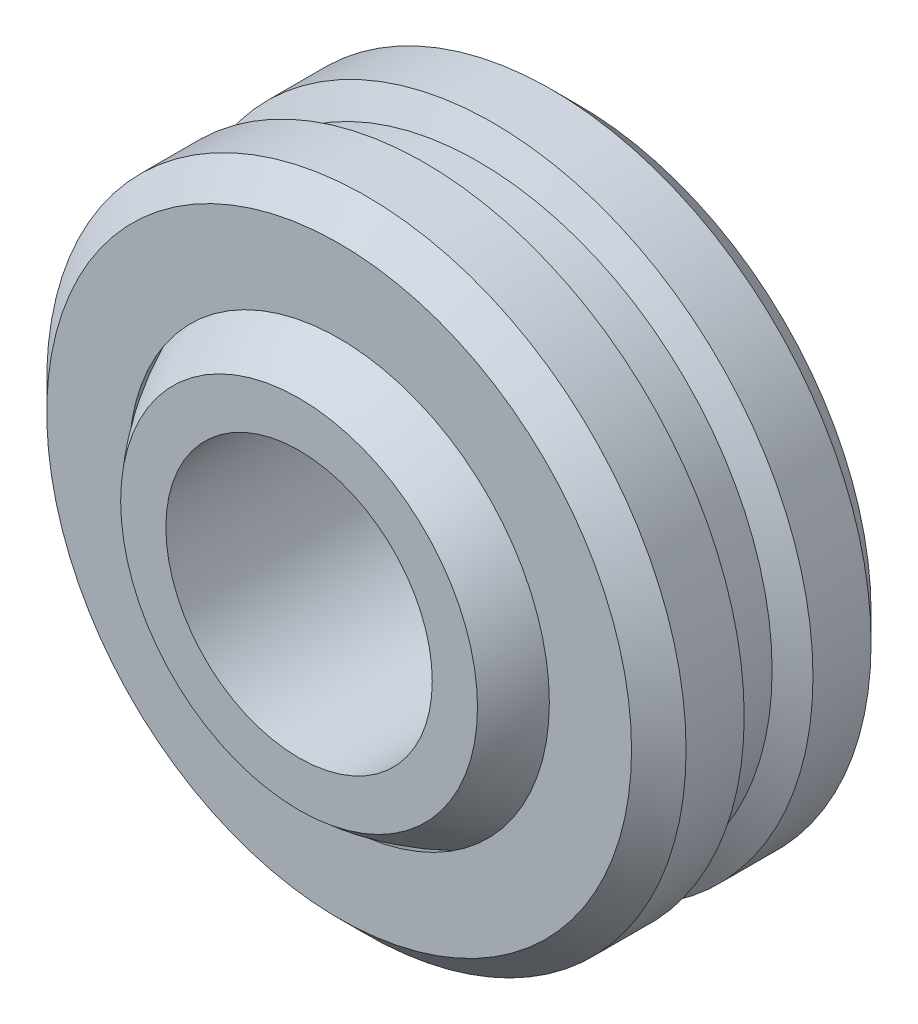
ISO-10303-21;
HEADER;
FILE_DESCRIPTION(('STEP AP214'),'2;1');
FILE_NAME('part.step','',(''),(''),'','','');
FILE_SCHEMA(('AUTOMOTIVE_DESIGN { 1 0 10303 214 1 1 1 1 }'));
ENDSEC;
DATA;
#1=APPLICATION_CONTEXT('core data for automotive mechanical design processes');
#2=APPLICATION_PROTOCOL_DEFINITION('international standard','automotive_design',2000,#1);
#3=PRODUCT_CONTEXT('',#1,'mechanical');
#4=PRODUCT('Part','Part','',(#3));
#5=PRODUCT_RELATED_PRODUCT_CATEGORY('part','',(#4));
#6=PRODUCT_DEFINITION_FORMATION('','',#4);
#7=PRODUCT_DEFINITION_CONTEXT('part definition',#1,'design');
#8=PRODUCT_DEFINITION('design','',#6,#7);
#9=PRODUCT_DEFINITION_SHAPE('','',#8);
#10=(LENGTH_UNIT() NAMED_UNIT(*) SI_UNIT(.MILLI.,.METRE.));
#11=(NAMED_UNIT(*) PLANE_ANGLE_UNIT() SI_UNIT($,.RADIAN.));
#12=(NAMED_UNIT(*) SI_UNIT($,.STERADIAN.) SOLID_ANGLE_UNIT());
#13=UNCERTAINTY_MEASURE_WITH_UNIT(LENGTH_MEASURE(1.E-05),#10,'distance_accuracy_value','');
#14=(GEOMETRIC_REPRESENTATION_CONTEXT(3) GLOBAL_UNCERTAINTY_ASSIGNED_CONTEXT((#13)) GLOBAL_UNIT_ASSIGNED_CONTEXT((#10,
#11,#12)) REPRESENTATION_CONTEXT('',''));
#15=CARTESIAN_POINT('',(0.,0.,0.));
#16=DIRECTION('',(0.,0.,1.));
#17=DIRECTION('',(1.,0.,0.));
#18=AXIS2_PLACEMENT_3D('',#15,#16,#17);
#19=CARTESIAN_POINT('',(0.,0.,0.));
#20=DIRECTION('',(0.,-1.,0.));
#21=DIRECTION('',(-1.,0.,0.));
#22=AXIS2_PLACEMENT_3D('',#19,#20,#21);
#23=SPHERICAL_SURFACE('',#22,7.1374);
#24=CARTESIAN_POINT('',(0.,0.,0.));
#25=DIRECTION('',(0.,0.,1.));
#26=DIRECTION('',(1.,0.,0.));
#27=AXIS2_PLACEMENT_3D('',#24,#25,#26);
#28=SPHERICAL_SURFACE('',#27,7.1374);
#29=CARTESIAN_POINT('',(0.,0.,-4.7625));
#30=DIRECTION('',(0.,0.,1.));
#31=DIRECTION('',(1.,0.,0.));
#32=AXIS2_PLACEMENT_3D('',#29,#30,#31);
#33=CIRCLE('',#32,5.31611441844511);
#34=CARTESIAN_POINT('',(5.31611441844511,0.,-4.7625));
#35=VERTEX_POINT('',#34);
#36=EDGE_CURVE('E52',#35,#35,#33,.F.);
#37=ORIENTED_EDGE('',*,*,#36,.F.);
#38=EDGE_LOOP('',(#37));
#39=FACE_BOUND('',#38,.T.);
#40=CARTESIAN_POINT('',(0.,0.,4.7625));
#41=DIRECTION('',(0.,0.,-1.));
#42=DIRECTION('',(-1.,0.,0.));
#43=AXIS2_PLACEMENT_3D('',#40,#41,#42);
#44=CIRCLE('',#43,5.31611441844511);
#45=CARTESIAN_POINT('',(-5.31611441844511,0.,4.7625));
#46=VERTEX_POINT('',#45);
#47=EDGE_CURVE('E11',#46,#46,#44,.F.);
#48=ORIENTED_EDGE('',*,*,#47,.F.);
#49=EDGE_LOOP('',(#48));
#50=FACE_BOUND('',#49,.T.);
#51=ADVANCED_FACE('F40',(#39,#50),#28,.T.);
#52=CARTESIAN_POINT('',(0.,0.,-7.1374));
#53=DIRECTION('',(0.,0.,1.));
#54=DIRECTION('',(1.,0.,0.));
#55=AXIS2_PLACEMENT_3D('',#52,#53,#54);
#56=CYLINDRICAL_SURFACE('',#55,3.96875);
#57=CARTESIAN_POINT('',(0.,0.,-4.7625));
#58=DIRECTION('',(0.,0.,1.));
#59=DIRECTION('',(1.,0.,0.));
#60=AXIS2_PLACEMENT_3D('',#57,#58,#59);
#61=CIRCLE('',#60,3.96875);
#62=CARTESIAN_POINT('',(3.96875,0.,-4.7625));
#63=VERTEX_POINT('',#62);
#64=EDGE_CURVE('E43',#63,#63,#61,.F.);
#65=ORIENTED_EDGE('',*,*,#64,.T.);
#66=EDGE_LOOP('',(#65));
#67=FACE_BOUND('',#66,.T.);
#68=CARTESIAN_POINT('',(0.,0.,4.7625));
#69=DIRECTION('',(0.,0.,-1.));
#70=DIRECTION('',(-1.,0.,0.));
#71=AXIS2_PLACEMENT_3D('',#68,#69,#70);
#72=CIRCLE('',#71,3.96875);
#73=CARTESIAN_POINT('',(-3.96875,0.,4.7625));
#74=VERTEX_POINT('',#73);
#75=EDGE_CURVE('E47',#74,#74,#72,.F.);
#76=ORIENTED_EDGE('',*,*,#75,.T.);
#77=EDGE_LOOP('',(#76));
#78=FACE_BOUND('',#77,.T.);
#79=ADVANCED_FACE('F60',(#67,#78),#56,.F.);
#80=CARTESIAN_POINT('',(-9.525,9.525,4.7625));
#81=DIRECTION('',(0.,0.,-1.));
#82=DIRECTION('',(-1.,0.,0.));
#83=AXIS2_PLACEMENT_3D('',#80,#81,#82);
#84=PLANE('',#83);
#85=ORIENTED_EDGE('',*,*,#47,.T.);
#86=EDGE_LOOP('',(#85));
#87=FACE_BOUND('',#86,.T.);
#88=ORIENTED_EDGE('',*,*,#75,.F.);
#89=EDGE_LOOP('',(#88));
#90=FACE_BOUND('',#89,.T.);
#91=ADVANCED_FACE('F65',(#87,#90),#84,.F.);
#92=CARTESIAN_POINT('',(-9.525,-9.525,-4.7625));
#93=DIRECTION('',(0.,0.,1.));
#94=DIRECTION('',(1.,0.,0.));
#95=AXIS2_PLACEMENT_3D('',#92,#93,#94);
#96=PLANE('',#95);
#97=ORIENTED_EDGE('',*,*,#36,.T.);
#98=EDGE_LOOP('',(#97));
#99=FACE_BOUND('',#98,.T.);
#100=ORIENTED_EDGE('',*,*,#64,.F.);
#101=EDGE_LOOP('',(#100));
#102=FACE_BOUND('',#101,.T.);
#103=ADVANCED_FACE('F63',(#99,#102),#96,.F.);
#104=CLOSED_SHELL('',(#51,#79,#91,#103));
#105=MANIFOLD_SOLID_BREP('B2',#104);
#106=CARTESIAN_POINT('',(0.,0.,3.5687));
#107=DIRECTION('',(0.,0.,-1.));
#108=DIRECTION('',(-1.,0.,0.));
#109=AXIS2_PLACEMENT_3D('',#106,#107,#108);
#110=CYLINDRICAL_SURFACE('',#109,9.525);
#111=CARTESIAN_POINT('',(0.,0.,2.7559));
#112=DIRECTION('',(0.,0.,1.));
#113=DIRECTION('',(1.,0.,0.));
#114=AXIS2_PLACEMENT_3D('',#111,#112,#113);
#115=CIRCLE('',#114,9.525);
#116=CARTESIAN_POINT('',(9.525,0.,2.7559));
#117=VERTEX_POINT('',#116);
#118=EDGE_CURVE('E108',#117,#117,#115,.F.);
#119=ORIENTED_EDGE('',*,*,#118,.T.);
#120=EDGE_LOOP('',(#119));
#121=FACE_BOUND('',#120,.T.);
#122=CARTESIAN_POINT('',(0.,0.,1.02481440153467));
#123=DIRECTION('',(0.,0.,1.));
#124=DIRECTION('',(1.,0.,0.));
#125=AXIS2_PLACEMENT_3D('',#122,#123,#124);
#126=CIRCLE('',#125,9.525);
#127=CARTESIAN_POINT('',(9.525,0.,1.02481440153467));
#128=VERTEX_POINT('',#127);
#129=EDGE_CURVE('E125',#128,#128,#126,.T.);
#130=ORIENTED_EDGE('',*,*,#129,.T.);
#131=EDGE_LOOP('',(#130));
#132=FACE_BOUND('',#131,.T.);
#133=ADVANCED_FACE('F101',(#121,#132),#110,.T.);
#134=CARTESIAN_POINT('',(0.,0.,-2.7559));
#135=DIRECTION('',(0.,0.,1.));
#136=DIRECTION('',(1.,0.,0.));
#137=AXIS2_PLACEMENT_3D('',#134,#135,#136);
#138=CIRCLE('',#137,9.525);
#139=CARTESIAN_POINT('',(9.525,0.,-2.7559));
#140=VERTEX_POINT('',#139);
#141=EDGE_CURVE('E112',#140,#140,#138,.T.);
#142=ORIENTED_EDGE('',*,*,#141,.T.);
#143=EDGE_LOOP('',(#142));
#144=FACE_BOUND('',#143,.T.);
#145=CARTESIAN_POINT('',(0.,0.,-1.02481440153467));
#146=DIRECTION('',(0.,0.,1.));
#147=DIRECTION('',(1.,0.,0.));
#148=AXIS2_PLACEMENT_3D('',#145,#146,#147);
#149=CIRCLE('',#148,9.525);
#150=CARTESIAN_POINT('',(9.525,0.,-1.02481440153467));
#151=VERTEX_POINT('',#150);
#152=EDGE_CURVE('E136',#151,#151,#149,.T.);
#153=ORIENTED_EDGE('',*,*,#152,.F.);
#154=EDGE_LOOP('',(#153));
#155=FACE_BOUND('',#154,.T.);
#156=ADVANCED_FACE('F143',(#144,#155),#110,.T.);
#157=CARTESIAN_POINT('',(0.,0.,3.5687));
#158=DIRECTION('',(0.,0.,1.));
#159=DIRECTION('',(1.,0.,0.));
#160=AXIS2_PLACEMENT_3D('',#157,#158,#159);
#161=PLANE('',#160);
#162=CARTESIAN_POINT('',(0.,0.,3.5687));
#163=DIRECTION('',(0.,0.,1.));
#164=DIRECTION('',(1.,0.,0.));
#165=AXIS2_PLACEMENT_3D('',#162,#163,#164);
#166=CIRCLE('',#165,8.7122);
#167=CARTESIAN_POINT('',(8.7122,0.,3.5687));
#168=VERTEX_POINT('',#167);
#169=EDGE_CURVE('E116',#168,#168,#166,.T.);
#170=ORIENTED_EDGE('',*,*,#169,.T.);
#171=EDGE_LOOP('',(#170));
#172=FACE_BOUND('',#171,.T.);
#173=CARTESIAN_POINT('',(0.,0.,3.5687));
#174=DIRECTION('',(0.,0.,1.));
#175=DIRECTION('',(1.,0.,0.));
#176=AXIS2_PLACEMENT_3D('',#173,#174,#175);
#177=CIRCLE('',#176,6.26344975976307);
#178=CARTESIAN_POINT('',(6.26344975976307,0.,3.5687));
#179=VERTEX_POINT('',#178);
#180=EDGE_CURVE('E121',#179,#179,#177,.T.);
#181=ORIENTED_EDGE('',*,*,#180,.F.);
#182=EDGE_LOOP('',(#181));
#183=FACE_BOUND('',#182,.T.);
#184=ADVANCED_FACE('F145',(#172,#183),#161,.T.);
#185=CARTESIAN_POINT('',(0.,0.,-3.5687));
#186=DIRECTION('',(0.,0.,1.));
#187=DIRECTION('',(1.,0.,0.));
#188=AXIS2_PLACEMENT_3D('',#185,#186,#187);
#189=PLANE('',#188);
#190=CARTESIAN_POINT('',(0.,0.,-3.5687));
#191=DIRECTION('',(0.,0.,1.));
#192=DIRECTION('',(1.,0.,0.));
#193=AXIS2_PLACEMENT_3D('',#190,#191,#192);
#194=CIRCLE('',#193,8.7122);
#195=CARTESIAN_POINT('',(8.7122,0.,-3.5687));
#196=VERTEX_POINT('',#195);
#197=EDGE_CURVE('E39',#196,#196,#194,.F.);
#198=ORIENTED_EDGE('',*,*,#197,.T.);
#199=EDGE_LOOP('',(#198));
#200=FACE_BOUND('',#199,.T.);
#201=CARTESIAN_POINT('',(0.,0.,-3.5687));
#202=DIRECTION('',(0.,0.,1.));
#203=DIRECTION('',(1.,0.,0.));
#204=AXIS2_PLACEMENT_3D('',#201,#202,#203);
#205=CIRCLE('',#204,6.26344975976307);
#206=CARTESIAN_POINT('',(6.26344975976307,0.,-3.5687));
#207=VERTEX_POINT('',#206);
#208=EDGE_CURVE('E122',#207,#207,#205,.T.);
#209=ORIENTED_EDGE('',*,*,#208,.T.);
#210=EDGE_LOOP('',(#209));
#211=FACE_BOUND('',#210,.T.);
#212=ADVANCED_FACE('F152',(#200,#211),#189,.F.);
#213=CARTESIAN_POINT('',(0.,0.,0.));
#214=DIRECTION('',(0.,-1.,0.));
#215=DIRECTION('',(-1.,0.,0.));
#216=AXIS2_PLACEMENT_3D('',#213,#214,#215);
#217=SPHERICAL_SURFACE('',#216,7.208774);
#218=CARTESIAN_POINT('',(0.,0.,0.));
#219=DIRECTION('',(0.,0.,1.));
#220=DIRECTION('',(1.,0.,0.));
#221=AXIS2_PLACEMENT_3D('',#218,#219,#220);
#222=SPHERICAL_SURFACE('',#221,7.208774);
#223=ORIENTED_EDGE('',*,*,#180,.T.);
#224=EDGE_LOOP('',(#223));
#225=FACE_BOUND('',#224,.T.);
#226=ORIENTED_EDGE('',*,*,#208,.F.);
#227=EDGE_LOOP('',(#226));
#228=FACE_BOUND('',#227,.T.);
#229=ADVANCED_FACE('F158',(#225,#228),#222,.F.);
#230=CARTESIAN_POINT('',(0.,0.,3.5687));
#231=DIRECTION('',(0.,0.,-1.));
#232=DIRECTION('',(-1.,0.,0.));
#233=AXIS2_PLACEMENT_3D('',#230,#231,#232);
#234=CONICAL_SURFACE('',#233,8.7122,0.785398163397445);
#235=ORIENTED_EDGE('',*,*,#118,.F.);
#236=EDGE_LOOP('',(#235));
#237=FACE_BOUND('',#236,.T.);
#238=ORIENTED_EDGE('',*,*,#169,.F.);
#239=EDGE_LOOP('',(#238));
#240=FACE_BOUND('',#239,.T.);
#241=ADVANCED_FACE('F156',(#237,#240),#234,.T.);
#242=CARTESIAN_POINT('',(0.,0.,-2.7559));
#243=DIRECTION('',(0.,0.,1.));
#244=DIRECTION('',(1.,0.,0.));
#245=AXIS2_PLACEMENT_3D('',#242,#243,#244);
#246=CONICAL_SURFACE('',#245,9.525,0.785398163397451);
#247=ORIENTED_EDGE('',*,*,#197,.F.);
#248=EDGE_LOOP('',(#247));
#249=FACE_BOUND('',#248,.T.);
#250=ORIENTED_EDGE('',*,*,#141,.F.);
#251=EDGE_LOOP('',(#250));
#252=FACE_BOUND('',#251,.T.);
#253=ADVANCED_FACE('F103',(#249,#252),#246,.T.);
#254=CARTESIAN_POINT('',(0.,0.,1.02481440153467));
#255=DIRECTION('',(0.,0.,1.));
#256=DIRECTION('',(1.,0.,0.));
#257=AXIS2_PLACEMENT_3D('',#254,#255,#256);
#258=CONICAL_SURFACE('',#257,9.525,1.0471975511966);
#259=CARTESIAN_POINT('',(0.,0.,0.5790565));
#260=DIRECTION('',(0.,0.,1.));
#261=DIRECTION('',(1.,0.,0.));
#262=AXIS2_PLACEMENT_3D('',#259,#260,#261);
#263=CIRCLE('',#262,8.75292466666667);
#264=CARTESIAN_POINT('',(8.75292466666667,0.,0.5790565));
#265=VERTEX_POINT('',#264);
#266=EDGE_CURVE('E130',#265,#265,#263,.T.);
#267=ORIENTED_EDGE('',*,*,#266,.T.);
#268=EDGE_LOOP('',(#267));
#269=FACE_BOUND('',#268,.T.);
#270=ORIENTED_EDGE('',*,*,#129,.F.);
#271=EDGE_LOOP('',(#270));
#272=FACE_BOUND('',#271,.T.);
#273=ADVANCED_FACE('F164',(#269,#272),#258,.T.);
#274=CARTESIAN_POINT('',(0.,0.,0.));
#275=DIRECTION('',(0.,0.,1.));
#276=DIRECTION('',(1.,0.,0.));
#277=AXIS2_PLACEMENT_3D('',#274,#275,#276);
#278=CYLINDRICAL_SURFACE('',#277,8.75292466666667);
#279=CARTESIAN_POINT('',(0.,0.,-0.5790565));
#280=DIRECTION('',(0.,0.,1.));
#281=DIRECTION('',(1.,0.,0.));
#282=AXIS2_PLACEMENT_3D('',#279,#280,#281);
#283=CIRCLE('',#282,8.75292466666667);
#284=CARTESIAN_POINT('',(8.75292466666667,0.,-0.5790565));
#285=VERTEX_POINT('',#284);
#286=EDGE_CURVE('E133',#285,#285,#283,.T.);
#287=ORIENTED_EDGE('',*,*,#286,.T.);
#288=EDGE_LOOP('',(#287));
#289=FACE_BOUND('',#288,.T.);
#290=ORIENTED_EDGE('',*,*,#266,.F.);
#291=EDGE_LOOP('',(#290));
#292=FACE_BOUND('',#291,.T.);
#293=ADVANCED_FACE('F218',(#289,#292),#278,.T.);
#294=CARTESIAN_POINT('',(0.,0.,-0.5790565));
#295=DIRECTION('',(0.,0.,-1.));
#296=DIRECTION('',(-1.,0.,0.));
#297=AXIS2_PLACEMENT_3D('',#294,#295,#296);
#298=CONICAL_SURFACE('',#297,8.75292466666667,1.0471975511966);
#299=ORIENTED_EDGE('',*,*,#152,.T.);
#300=EDGE_LOOP('',(#299));
#301=FACE_BOUND('',#300,.T.);
#302=ORIENTED_EDGE('',*,*,#286,.F.);
#303=EDGE_LOOP('',(#302));
#304=FACE_BOUND('',#303,.T.);
#305=ADVANCED_FACE('F140',(#301,#304),#298,.T.);
#306=CLOSED_SHELL('',(#133,#156,#184,#212,#229,#241,#253,#273,#293,#305));
#307=MANIFOLD_SOLID_BREP('B6',#306);
#308=ADVANCED_BREP_SHAPE_REPRESENTATION('',(#18,#105,#307),#14);
#309=SHAPE_DEFINITION_REPRESENTATION(#9,#308);
ENDSEC;
END-ISO-10303-21;
